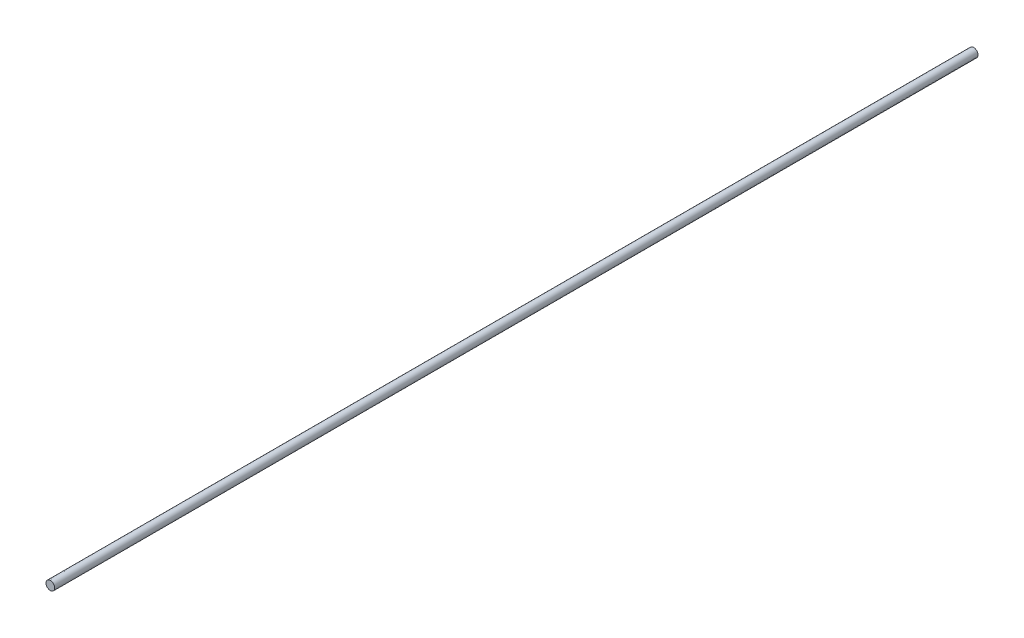
ISO-10303-21;
HEADER;
FILE_DESCRIPTION(('STEP AP214'),'2;1');
FILE_NAME('part.step','',(''),(''),'','','');
FILE_SCHEMA(('AUTOMOTIVE_DESIGN { 1 0 10303 214 1 1 1 1 }'));
ENDSEC;
DATA;
#1=APPLICATION_CONTEXT('core data for automotive mechanical design processes');
#2=APPLICATION_PROTOCOL_DEFINITION('international standard','automotive_design',2000,#1);
#3=PRODUCT_CONTEXT('',#1,'mechanical');
#4=PRODUCT('Part','Part','',(#3));
#5=PRODUCT_RELATED_PRODUCT_CATEGORY('part','',(#4));
#6=PRODUCT_DEFINITION_FORMATION('','',#4);
#7=PRODUCT_DEFINITION_CONTEXT('part definition',#1,'design');
#8=PRODUCT_DEFINITION('design','',#6,#7);
#9=PRODUCT_DEFINITION_SHAPE('','',#8);
#10=(LENGTH_UNIT() NAMED_UNIT(*) SI_UNIT(.MILLI.,.METRE.));
#11=(NAMED_UNIT(*) PLANE_ANGLE_UNIT() SI_UNIT($,.RADIAN.));
#12=(NAMED_UNIT(*) SI_UNIT($,.STERADIAN.) SOLID_ANGLE_UNIT());
#13=UNCERTAINTY_MEASURE_WITH_UNIT(LENGTH_MEASURE(1.E-05),#10,'distance_accuracy_value','');
#14=(GEOMETRIC_REPRESENTATION_CONTEXT(3) GLOBAL_UNCERTAINTY_ASSIGNED_CONTEXT((#13)) GLOBAL_UNIT_ASSIGNED_CONTEXT((#10,
#11,#12)) REPRESENTATION_CONTEXT('',''));
#15=CARTESIAN_POINT('',(0.,0.,0.));
#16=DIRECTION('',(0.,0.,1.));
#17=DIRECTION('',(1.,0.,0.));
#18=AXIS2_PLACEMENT_3D('',#15,#16,#17);
#19=CARTESIAN_POINT('',(0.,0.,422.5));
#20=DIRECTION('',(0.,0.,-1.));
#21=DIRECTION('',(-1.,0.,0.));
#22=AXIS2_PLACEMENT_3D('',#19,#20,#21);
#23=CYLINDRICAL_SURFACE('',#22,4.);
#24=CARTESIAN_POINT('',(0.,0.,422.5));
#25=DIRECTION('',(0.,0.,1.));
#26=DIRECTION('',(1.,0.,0.));
#27=AXIS2_PLACEMENT_3D('',#24,#25,#26);
#28=CIRCLE('',#27,4.);
#29=CARTESIAN_POINT('',(4.,0.,422.5));
#30=VERTEX_POINT('',#29);
#31=EDGE_CURVE('E10',#30,#30,#28,.T.);
#32=ORIENTED_EDGE('',*,*,#31,.F.);
#33=EDGE_LOOP('',(#32));
#34=FACE_BOUND('',#33,.T.);
#35=CARTESIAN_POINT('',(0.,0.,-422.5));
#36=DIRECTION('',(0.,0.,1.));
#37=DIRECTION('',(1.,0.,0.));
#38=AXIS2_PLACEMENT_3D('',#35,#36,#37);
#39=CIRCLE('',#38,4.);
#40=CARTESIAN_POINT('',(4.,0.,-422.5));
#41=VERTEX_POINT('',#40);
#42=EDGE_CURVE('E37',#41,#41,#39,.T.);
#43=ORIENTED_EDGE('',*,*,#42,.T.);
#44=EDGE_LOOP('',(#43));
#45=FACE_BOUND('',#44,.T.);
#46=ADVANCED_FACE('F34',(#34,#45),#23,.T.);
#47=CARTESIAN_POINT('',(0.,0.,422.5));
#48=DIRECTION('',(0.,0.,1.));
#49=DIRECTION('',(1.,0.,0.));
#50=AXIS2_PLACEMENT_3D('',#47,#48,#49);
#51=PLANE('',#50);
#52=ORIENTED_EDGE('',*,*,#31,.T.);
#53=EDGE_LOOP('',(#52));
#54=FACE_BOUND('',#53,.T.);
#55=ADVANCED_FACE('F49',(#54),#51,.T.);
#56=CARTESIAN_POINT('',(0.,0.,-422.5));
#57=DIRECTION('',(0.,0.,1.));
#58=DIRECTION('',(1.,0.,0.));
#59=AXIS2_PLACEMENT_3D('',#56,#57,#58);
#60=PLANE('',#59);
#61=ORIENTED_EDGE('',*,*,#42,.F.);
#62=EDGE_LOOP('',(#61));
#63=FACE_BOUND('',#62,.T.);
#64=ADVANCED_FACE('F47',(#63),#60,.F.);
#65=CLOSED_SHELL('',(#46,#55,#64));
#66=MANIFOLD_SOLID_BREP('B2',#65);
#67=ADVANCED_BREP_SHAPE_REPRESENTATION('',(#18,#66),#14);
#68=SHAPE_DEFINITION_REPRESENTATION(#9,#67);
ENDSEC;
END-ISO-10303-21;
